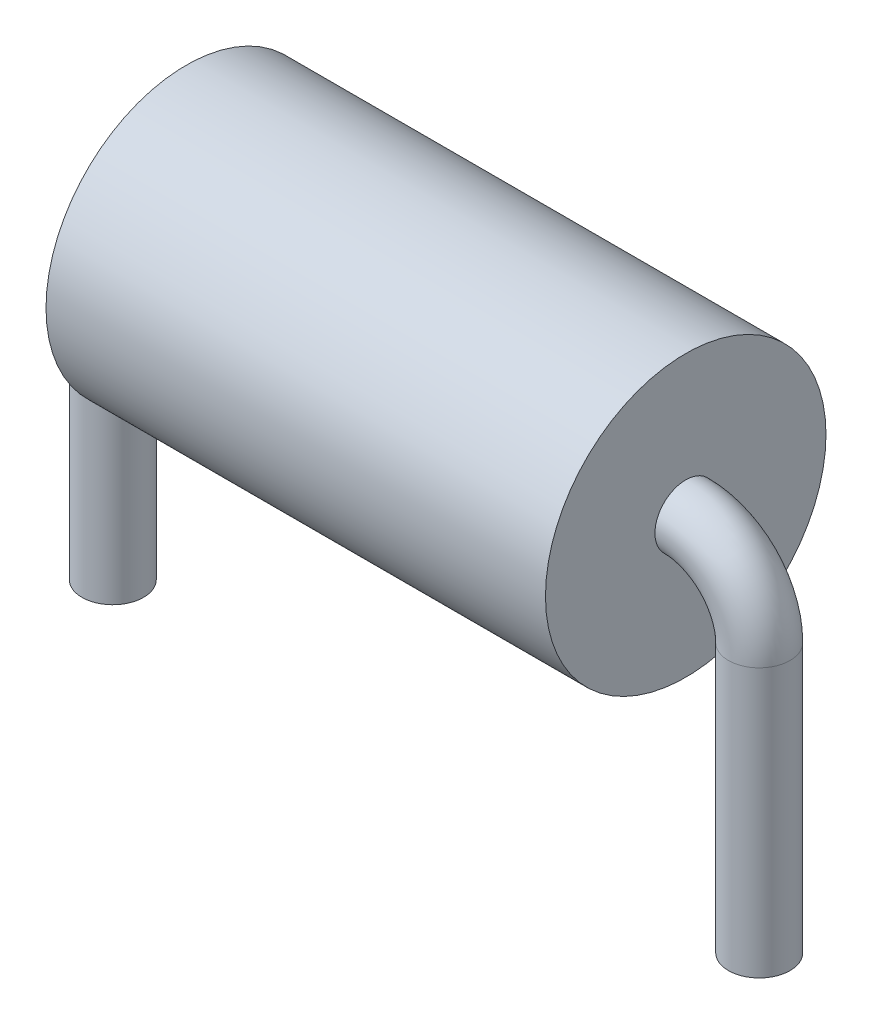
ISO-10303-21;
HEADER;
FILE_DESCRIPTION(('STEP AP214'),'2;1');
FILE_NAME('part.step','',(''),(''),'','','');
FILE_SCHEMA(('AUTOMOTIVE_DESIGN { 1 0 10303 214 1 1 1 1 }'));
ENDSEC;
DATA;
#1=APPLICATION_CONTEXT('core data for automotive mechanical design processes');
#2=APPLICATION_PROTOCOL_DEFINITION('international standard','automotive_design',2000,#1);
#3=PRODUCT_CONTEXT('',#1,'mechanical');
#4=PRODUCT('Part','Part','',(#3));
#5=PRODUCT_RELATED_PRODUCT_CATEGORY('part','',(#4));
#6=PRODUCT_DEFINITION_FORMATION('','',#4);
#7=PRODUCT_DEFINITION_CONTEXT('part definition',#1,'design');
#8=PRODUCT_DEFINITION('design','',#6,#7);
#9=PRODUCT_DEFINITION_SHAPE('','',#8);
#10=(LENGTH_UNIT() NAMED_UNIT(*) SI_UNIT(.MILLI.,.METRE.));
#11=(NAMED_UNIT(*) PLANE_ANGLE_UNIT() SI_UNIT($,.RADIAN.));
#12=(NAMED_UNIT(*) SI_UNIT($,.STERADIAN.) SOLID_ANGLE_UNIT());
#13=UNCERTAINTY_MEASURE_WITH_UNIT(LENGTH_MEASURE(1.E-05),#10,'distance_accuracy_value','');
#14=(GEOMETRIC_REPRESENTATION_CONTEXT(3) GLOBAL_UNCERTAINTY_ASSIGNED_CONTEXT((#13)) GLOBAL_UNIT_ASSIGNED_CONTEXT((#10,
#11,#12)) REPRESENTATION_CONTEXT('',''));
#15=CARTESIAN_POINT('',(0.,0.,0.));
#16=DIRECTION('',(0.,0.,1.));
#17=DIRECTION('',(1.,0.,0.));
#18=AXIS2_PLACEMENT_3D('',#15,#16,#17);
#19=CARTESIAN_POINT('',(4.6355,0.,0.));
#20=DIRECTION('',(-1.,0.,0.));
#21=DIRECTION('',(0.,0.,1.));
#22=AXIS2_PLACEMENT_3D('',#19,#20,#21);
#23=CYLINDRICAL_SURFACE('',#22,2.6035);
#24=CARTESIAN_POINT('',(4.6355,0.,0.));
#25=DIRECTION('',(1.,0.,0.));
#26=DIRECTION('',(0.,0.,-1.));
#27=AXIS2_PLACEMENT_3D('',#24,#25,#26);
#28=CIRCLE('',#27,2.6035);
#29=CARTESIAN_POINT('',(4.6355,0.,-2.6035));
#30=VERTEX_POINT('',#29);
#31=EDGE_CURVE('E50',#30,#30,#28,.T.);
#32=ORIENTED_EDGE('',*,*,#31,.F.);
#33=EDGE_LOOP('',(#32));
#34=FACE_BOUND('',#33,.T.);
#35=CARTESIAN_POINT('',(-4.6355,0.,0.));
#36=DIRECTION('',(1.,0.,0.));
#37=DIRECTION('',(0.,0.,-1.));
#38=AXIS2_PLACEMENT_3D('',#35,#36,#37);
#39=CIRCLE('',#38,2.6035);
#40=CARTESIAN_POINT('',(-4.6355,0.,-2.6035));
#41=VERTEX_POINT('',#40);
#42=EDGE_CURVE('E51',#41,#41,#39,.T.);
#43=ORIENTED_EDGE('',*,*,#42,.T.);
#44=EDGE_LOOP('',(#43));
#45=FACE_BOUND('',#44,.T.);
#46=ADVANCED_FACE('F41',(#34,#45),#23,.T.);
#47=CARTESIAN_POINT('',(4.6355,0.,0.));
#48=DIRECTION('',(1.,0.,0.));
#49=DIRECTION('',(0.,0.,-1.));
#50=AXIS2_PLACEMENT_3D('',#47,#48,#49);
#51=PLANE('',#50);
#52=CARTESIAN_POINT('',(4.6355,0.,0.));
#53=DIRECTION('',(1.,0.,0.));
#54=DIRECTION('',(0.,0.,-1.));
#55=AXIS2_PLACEMENT_3D('',#52,#53,#54);
#56=CIRCLE('',#55,0.5715);
#57=CARTESIAN_POINT('',(4.6355,0.571499999999999,0.));
#58=VERTEX_POINT('',#57);
#59=EDGE_CURVE('E10',#58,#58,#56,.T.);
#60=ORIENTED_EDGE('',*,*,#59,.F.);
#61=EDGE_LOOP('',(#60));
#62=FACE_BOUND('',#61,.T.);
#63=ORIENTED_EDGE('',*,*,#31,.T.);
#64=EDGE_LOOP('',(#63));
#65=FACE_BOUND('',#64,.T.);
#66=ADVANCED_FACE('F88',(#62,#65),#51,.T.);
#67=CARTESIAN_POINT('',(-4.6355,0.,0.));
#68=DIRECTION('',(1.,0.,0.));
#69=DIRECTION('',(0.,0.,-1.));
#70=AXIS2_PLACEMENT_3D('',#67,#68,#69);
#71=PLANE('',#70);
#72=CARTESIAN_POINT('',(-4.6355,0.,0.));
#73=DIRECTION('',(1.,0.,0.));
#74=DIRECTION('',(0.,1.,0.));
#75=AXIS2_PLACEMENT_3D('',#72,#73,#74);
#76=CIRCLE('',#75,0.5715);
#77=CARTESIAN_POINT('',(-4.6355,0.571499999999999,0.));
#78=VERTEX_POINT('',#77);
#79=EDGE_CURVE('E64',#78,#78,#76,.T.);
#80=ORIENTED_EDGE('',*,*,#79,.T.);
#81=EDGE_LOOP('',(#80));
#82=FACE_BOUND('',#81,.T.);
#83=ORIENTED_EDGE('',*,*,#42,.F.);
#84=EDGE_LOOP('',(#83));
#85=FACE_BOUND('',#84,.T.);
#86=ADVANCED_FACE('F80',(#82,#85),#71,.F.);
#87=CARTESIAN_POINT('',(-6.,-6.35,0.));
#88=DIRECTION('',(0.,1.,0.));
#89=DIRECTION('',(-1.,0.,0.));
#90=AXIS2_PLACEMENT_3D('',#87,#88,#89);
#91=PLANE('',#90);
#92=CARTESIAN_POINT('',(-6.,-6.35,0.));
#93=DIRECTION('',(0.,1.,0.));
#94=DIRECTION('',(-1.,0.,0.));
#95=AXIS2_PLACEMENT_3D('',#92,#93,#94);
#96=CIRCLE('',#95,0.5715);
#97=CARTESIAN_POINT('',(-6.5715,-6.35,0.));
#98=VERTEX_POINT('',#97);
#99=EDGE_CURVE('E66',#98,#98,#96,.T.);
#100=ORIENTED_EDGE('',*,*,#99,.F.);
#101=EDGE_LOOP('',(#100));
#102=FACE_BOUND('',#101,.T.);
#103=ADVANCED_FACE('F73',(#102),#91,.F.);
#104=CARTESIAN_POINT('',(-6.,-6.35,0.));
#105=DIRECTION('',(0.,1.,0.));
#106=DIRECTION('',(-1.,0.,0.));
#107=AXIS2_PLACEMENT_3D('',#104,#105,#106);
#108=CYLINDRICAL_SURFACE('',#107,0.5715);
#109=CARTESIAN_POINT('',(-6.,-1.3645,0.));
#110=DIRECTION('',(0.,1.,0.));
#111=DIRECTION('',(-1.,0.,0.));
#112=AXIS2_PLACEMENT_3D('',#109,#110,#111);
#113=CIRCLE('',#112,0.5715);
#114=CARTESIAN_POINT('',(-6.5715,-1.3645,0.));
#115=VERTEX_POINT('',#114);
#116=EDGE_CURVE('E67',#115,#115,#113,.T.);
#117=ORIENTED_EDGE('',*,*,#116,.F.);
#118=EDGE_LOOP('',(#117));
#119=FACE_BOUND('',#118,.T.);
#120=ORIENTED_EDGE('',*,*,#99,.T.);
#121=EDGE_LOOP('',(#120));
#122=FACE_BOUND('',#121,.T.);
#123=ADVANCED_FACE('F71',(#119,#122),#108,.T.);
#124=CARTESIAN_POINT('',(-4.6355,-1.3645,0.));
#125=DIRECTION('',(0.,0.,-1.));
#126=DIRECTION('',(-1.,0.,0.));
#127=AXIS2_PLACEMENT_3D('',#124,#125,#126);
#128=TOROIDAL_SURFACE('',#127,1.3645,0.5715);
#129=CARTESIAN_POINT('',(-4.6355,-1.3645,0.));
#130=DIRECTION('',(0.,0.,-1.));
#131=DIRECTION('',(-1.,0.,0.));
#132=AXIS2_PLACEMENT_3D('',#129,#130,#131);
#133=CIRCLE('',#132,1.936);
#134=EDGE_CURVE('',#115,#78,#133,.T.);
#135=ORIENTED_EDGE('',*,*,#116,.T.);
#136=ORIENTED_EDGE('',*,*,#79,.F.);
#137=ORIENTED_EDGE('',*,*,#134,.T.);
#138=ORIENTED_EDGE('',*,*,#134,.F.);
#139=EDGE_LOOP('',(#135,#137,#136,#138));
#140=FACE_BOUND('',#139,.T.);
#141=ADVANCED_FACE('F84',(#140),#128,.T.);
#142=CARTESIAN_POINT('',(6.,-6.35,0.));
#143=DIRECTION('',(0.,-1.,0.));
#144=DIRECTION('',(1.,0.,0.));
#145=AXIS2_PLACEMENT_3D('',#142,#143,#144);
#146=PLANE('',#145);
#147=CARTESIAN_POINT('',(6.,-6.35,0.));
#148=DIRECTION('',(0.,-1.,0.));
#149=DIRECTION('',(1.,0.,0.));
#150=AXIS2_PLACEMENT_3D('',#147,#148,#149);
#151=CIRCLE('',#150,0.5715);
#152=CARTESIAN_POINT('',(6.5715,-6.35,0.));
#153=VERTEX_POINT('',#152);
#154=EDGE_CURVE('E57',#153,#153,#151,.T.);
#155=ORIENTED_EDGE('',*,*,#154,.T.);
#156=EDGE_LOOP('',(#155));
#157=FACE_BOUND('',#156,.T.);
#158=ADVANCED_FACE('F121',(#157),#146,.T.);
#159=CARTESIAN_POINT('',(4.6355,-1.3645,0.));
#160=DIRECTION('',(0.,0.,-1.));
#161=DIRECTION('',(-1.,0.,0.));
#162=AXIS2_PLACEMENT_3D('',#159,#160,#161);
#163=TOROIDAL_SURFACE('',#162,1.3645,0.5715);
#164=CARTESIAN_POINT('',(6.,-1.3645,0.));
#165=DIRECTION('',(0.,-1.,0.));
#166=DIRECTION('',(1.,0.,0.));
#167=AXIS2_PLACEMENT_3D('',#164,#165,#166);
#168=CIRCLE('',#167,0.5715);
#169=CARTESIAN_POINT('',(6.5715,-1.3645,0.));
#170=VERTEX_POINT('',#169);
#171=EDGE_CURVE('E58',#170,#170,#168,.T.);
#172=CARTESIAN_POINT('',(4.6355,-1.3645,0.));
#173=DIRECTION('',(0.,0.,-1.));
#174=DIRECTION('',(-1.,0.,0.));
#175=AXIS2_PLACEMENT_3D('',#172,#173,#174);
#176=CIRCLE('',#175,1.936);
#177=EDGE_CURVE('',#58,#170,#176,.T.);
#178=ORIENTED_EDGE('',*,*,#59,.T.);
#179=ORIENTED_EDGE('',*,*,#171,.F.);
#180=ORIENTED_EDGE('',*,*,#177,.T.);
#181=ORIENTED_EDGE('',*,*,#177,.F.);
#182=EDGE_LOOP('',(#178,#180,#179,#181));
#183=FACE_BOUND('',#182,.T.);
#184=ADVANCED_FACE('F133',(#183),#163,.T.);
#185=CARTESIAN_POINT('',(6.,-1.3645,0.));
#186=DIRECTION('',(0.,-1.,0.));
#187=DIRECTION('',(1.,0.,0.));
#188=AXIS2_PLACEMENT_3D('',#185,#186,#187);
#189=CYLINDRICAL_SURFACE('',#188,0.5715);
#190=ORIENTED_EDGE('',*,*,#154,.F.);
#191=EDGE_LOOP('',(#190));
#192=FACE_BOUND('',#191,.T.);
#193=ORIENTED_EDGE('',*,*,#171,.T.);
#194=EDGE_LOOP('',(#193));
#195=FACE_BOUND('',#194,.T.);
#196=ADVANCED_FACE('F130',(#192,#195),#189,.T.);
#197=CLOSED_SHELL('',(#46,#66,#86,#103,#123,#141,#158,#184,#196));
#198=MANIFOLD_SOLID_BREP('B2',#197);
#199=ADVANCED_BREP_SHAPE_REPRESENTATION('',(#18,#198),#14);
#200=SHAPE_DEFINITION_REPRESENTATION(#9,#199);
ENDSEC;
END-ISO-10303-21;
